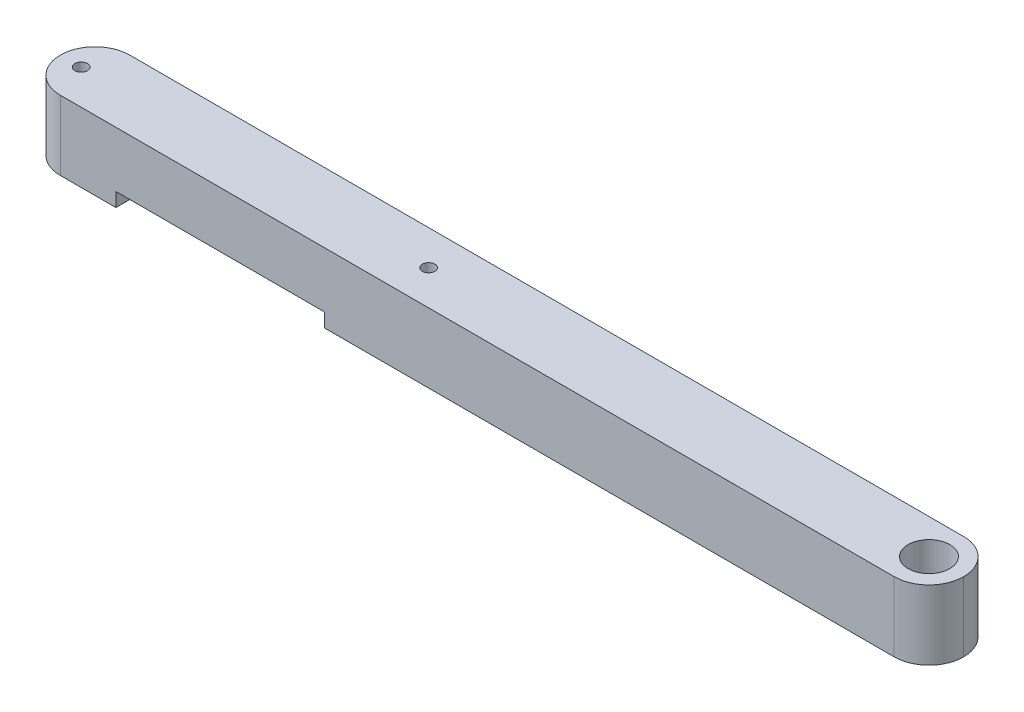
ISO-10303-21;
HEADER;
FILE_DESCRIPTION(('STEP AP214'),'2;1');
FILE_NAME('part.step','',(''),(''),'','','');
FILE_SCHEMA(('AUTOMOTIVE_DESIGN { 1 0 10303 214 1 1 1 1 }'));
ENDSEC;
DATA;
#1=APPLICATION_CONTEXT('core data for automotive mechanical design processes');
#2=APPLICATION_PROTOCOL_DEFINITION('international standard','automotive_design',2000,#1);
#3=PRODUCT_CONTEXT('',#1,'mechanical');
#4=PRODUCT('Part','Part','',(#3));
#5=PRODUCT_RELATED_PRODUCT_CATEGORY('part','',(#4));
#6=PRODUCT_DEFINITION_FORMATION('','',#4);
#7=PRODUCT_DEFINITION_CONTEXT('part definition',#1,'design');
#8=PRODUCT_DEFINITION('design','',#6,#7);
#9=PRODUCT_DEFINITION_SHAPE('','',#8);
#10=(LENGTH_UNIT() NAMED_UNIT(*) SI_UNIT(.MILLI.,.METRE.));
#11=(NAMED_UNIT(*) PLANE_ANGLE_UNIT() SI_UNIT($,.RADIAN.));
#12=(NAMED_UNIT(*) SI_UNIT($,.STERADIAN.) SOLID_ANGLE_UNIT());
#13=UNCERTAINTY_MEASURE_WITH_UNIT(LENGTH_MEASURE(1.E-05),#10,'distance_accuracy_value','');
#14=(GEOMETRIC_REPRESENTATION_CONTEXT(3) GLOBAL_UNCERTAINTY_ASSIGNED_CONTEXT((#13)) GLOBAL_UNIT_ASSIGNED_CONTEXT((#10,
#11,#12)) REPRESENTATION_CONTEXT('',''));
#15=CARTESIAN_POINT('',(0.,0.,0.));
#16=DIRECTION('',(0.,0.,1.));
#17=DIRECTION('',(1.,0.,0.));
#18=AXIS2_PLACEMENT_3D('',#15,#16,#17);
#19=CARTESIAN_POINT('',(0.,0.,0.));
#20=DIRECTION('',(0.,-1.,0.));
#21=DIRECTION('',(0.,0.,-1.));
#22=AXIS2_PLACEMENT_3D('',#19,#20,#21);
#23=PLANE('',#22);
#24=DIRECTION('',(1.,0.,0.));
#25=VECTOR('',#24,1.);
#26=CARTESIAN_POINT('',(0.,0.,0.));
#27=LINE('',#26,#25);
#28=CARTESIAN_POINT('',(5.,0.,0.));
#29=VERTEX_POINT('',#28);
#30=CARTESIAN_POINT('',(13.,0.,0.));
#31=VERTEX_POINT('',#30);
#32=EDGE_CURVE('E137',#29,#31,#27,.T.);
#33=ORIENTED_EDGE('',*,*,#32,.F.);
#34=CARTESIAN_POINT('',(5.,0.,-5.));
#35=DIRECTION('',(0.,-1.,0.));
#36=DIRECTION('',(0.,0.,-1.));
#37=AXIS2_PLACEMENT_3D('',#34,#35,#36);
#38=CIRCLE('',#37,5.);
#39=CARTESIAN_POINT('',(0.,0.,-5.));
#40=VERTEX_POINT('',#39);
#41=EDGE_CURVE('E11',#29,#40,#38,.T.);
#42=ORIENTED_EDGE('',*,*,#41,.T.);
#43=CARTESIAN_POINT('',(5.,0.,-5.));
#44=DIRECTION('',(0.,-1.,0.));
#45=DIRECTION('',(0.,0.,-1.));
#46=AXIS2_PLACEMENT_3D('',#43,#44,#45);
#47=CIRCLE('',#46,5.);
#48=CARTESIAN_POINT('',(5.,0.,-10.));
#49=VERTEX_POINT('',#48);
#50=EDGE_CURVE('E48',#40,#49,#47,.T.);
#51=ORIENTED_EDGE('',*,*,#50,.T.);
#52=DIRECTION('',(-1.,0.,0.));
#53=VECTOR('',#52,1.);
#54=CARTESIAN_POINT('',(0.,0.,-10.));
#55=LINE('',#54,#53);
#56=CARTESIAN_POINT('',(13.,0.,-10.));
#57=VERTEX_POINT('',#56);
#58=EDGE_CURVE('E129',#57,#49,#55,.T.);
#59=ORIENTED_EDGE('',*,*,#58,.F.);
#60=DIRECTION('',(0.,0.,1.));
#61=VECTOR('',#60,1.);
#62=CARTESIAN_POINT('',(13.,0.,-10.));
#63=LINE('',#62,#61);
#64=EDGE_CURVE('E115',#57,#31,#63,.T.);
#65=ORIENTED_EDGE('',*,*,#64,.T.);
#66=EDGE_LOOP('',(#33,#42,#51,#59,#65));
#67=FACE_BOUND('',#66,.T.);
#68=CARTESIAN_POINT('',(3.,0.,-5.));
#69=DIRECTION('',(0.,1.,0.));
#70=DIRECTION('',(0.,0.,1.));
#71=AXIS2_PLACEMENT_3D('',#68,#69,#70);
#72=CIRCLE('',#71,0.9);
#73=CARTESIAN_POINT('',(3.,0.,-4.1));
#74=VERTEX_POINT('',#73);
#75=EDGE_CURVE('E188',#74,#74,#72,.T.);
#76=ORIENTED_EDGE('',*,*,#75,.T.);
#77=EDGE_LOOP('',(#76));
#78=FACE_BOUND('',#77,.T.);
#79=ADVANCED_FACE('F39',(#67,#78),#23,.T.);
#80=CARTESIAN_POINT('',(0.,10.,0.));
#81=DIRECTION('',(0.,-1.,0.));
#82=DIRECTION('',(0.,0.,-1.));
#83=AXIS2_PLACEMENT_3D('',#80,#81,#82);
#84=PLANE('',#83);
#85=DIRECTION('',(1.,0.,0.));
#86=VECTOR('',#85,1.);
#87=CARTESIAN_POINT('',(0.,10.,0.));
#88=LINE('',#87,#86);
#89=CARTESIAN_POINT('',(5.,10.,0.));
#90=VERTEX_POINT('',#89);
#91=CARTESIAN_POINT('',(125.,10.,0.));
#92=VERTEX_POINT('',#91);
#93=EDGE_CURVE('E139',#90,#92,#88,.T.);
#94=ORIENTED_EDGE('',*,*,#93,.T.);
#95=CARTESIAN_POINT('',(125.,10.,-5.));
#96=DIRECTION('',(0.,-1.,0.));
#97=DIRECTION('',(0.,0.,-1.));
#98=AXIS2_PLACEMENT_3D('',#95,#96,#97);
#99=CIRCLE('',#98,5.);
#100=CARTESIAN_POINT('',(130.,10.,-5.));
#101=VERTEX_POINT('',#100);
#102=EDGE_CURVE('E161',#92,#101,#99,.F.);
#103=ORIENTED_EDGE('',*,*,#102,.T.);
#104=CARTESIAN_POINT('',(125.,10.,-5.));
#105=DIRECTION('',(0.,-1.,0.));
#106=DIRECTION('',(0.,0.,-1.));
#107=AXIS2_PLACEMENT_3D('',#104,#105,#106);
#108=CIRCLE('',#107,5.);
#109=CARTESIAN_POINT('',(125.,10.,-10.));
#110=VERTEX_POINT('',#109);
#111=EDGE_CURVE('E159',#101,#110,#108,.F.);
#112=ORIENTED_EDGE('',*,*,#111,.T.);
#113=DIRECTION('',(-1.,0.,0.));
#114=VECTOR('',#113,1.);
#115=CARTESIAN_POINT('',(0.,10.,-10.));
#116=LINE('',#115,#114);
#117=CARTESIAN_POINT('',(5.,10.,-10.));
#118=VERTEX_POINT('',#117);
#119=EDGE_CURVE('E147',#110,#118,#116,.T.);
#120=ORIENTED_EDGE('',*,*,#119,.T.);
#121=CARTESIAN_POINT('',(5.,10.,-5.));
#122=DIRECTION('',(0.,-1.,0.));
#123=DIRECTION('',(0.,0.,-1.));
#124=AXIS2_PLACEMENT_3D('',#121,#122,#123);
#125=CIRCLE('',#124,5.);
#126=CARTESIAN_POINT('',(0.,10.,-5.));
#127=VERTEX_POINT('',#126);
#128=EDGE_CURVE('E155',#118,#127,#125,.F.);
#129=ORIENTED_EDGE('',*,*,#128,.T.);
#130=CARTESIAN_POINT('',(5.,10.,-5.));
#131=DIRECTION('',(0.,-1.,0.));
#132=DIRECTION('',(0.,0.,-1.));
#133=AXIS2_PLACEMENT_3D('',#130,#131,#132);
#134=CIRCLE('',#133,5.);
#135=EDGE_CURVE('E157',#127,#90,#134,.F.);
#136=ORIENTED_EDGE('',*,*,#135,.T.);
#137=EDGE_LOOP('',(#94,#103,#112,#120,#129,#136));
#138=FACE_BOUND('',#137,.T.);
#139=CARTESIAN_POINT('',(3.,10.,-5.));
#140=DIRECTION('',(0.,1.,0.));
#141=DIRECTION('',(0.,0.,1.));
#142=AXIS2_PLACEMENT_3D('',#139,#140,#141);
#143=CIRCLE('',#142,0.9);
#144=CARTESIAN_POINT('',(3.,10.,-4.1));
#145=VERTEX_POINT('',#144);
#146=EDGE_CURVE('E191',#145,#145,#143,.T.);
#147=ORIENTED_EDGE('',*,*,#146,.F.);
#148=EDGE_LOOP('',(#147));
#149=FACE_BOUND('',#148,.T.);
#150=CARTESIAN_POINT('',(53.,10.,-5.));
#151=DIRECTION('',(0.,1.,0.));
#152=DIRECTION('',(0.,0.,1.));
#153=AXIS2_PLACEMENT_3D('',#150,#151,#152);
#154=CIRCLE('',#153,0.899999999999997);
#155=CARTESIAN_POINT('',(53.,10.,-4.1));
#156=VERTEX_POINT('',#155);
#157=EDGE_CURVE('E192',#156,#156,#154,.T.);
#158=ORIENTED_EDGE('',*,*,#157,.F.);
#159=EDGE_LOOP('',(#158));
#160=FACE_BOUND('',#159,.T.);
#161=CARTESIAN_POINT('',(125.,10.,-5.));
#162=DIRECTION('',(0.,1.,0.));
#163=DIRECTION('',(0.,0.,1.));
#164=AXIS2_PLACEMENT_3D('',#161,#162,#163);
#165=CIRCLE('',#164,2.99999999999999);
#166=CARTESIAN_POINT('',(125.,10.,-2.00000000000001));
#167=VERTEX_POINT('',#166);
#168=EDGE_CURVE('E198',#167,#167,#165,.T.);
#169=ORIENTED_EDGE('',*,*,#168,.F.);
#170=EDGE_LOOP('',(#169));
#171=FACE_BOUND('',#170,.T.);
#172=ADVANCED_FACE('F183',(#138,#149,#160,#171),#84,.F.);
#173=CARTESIAN_POINT('',(125.,0.,-5.));
#174=DIRECTION('',(0.,-1.,0.));
#175=DIRECTION('',(0.,0.,-1.));
#176=AXIS2_PLACEMENT_3D('',#173,#174,#175);
#177=CIRCLE('',#176,5.);
#178=CARTESIAN_POINT('',(125.,0.,-10.));
#179=VERTEX_POINT('',#178);
#180=CARTESIAN_POINT('',(130.,0.,-5.));
#181=VERTEX_POINT('',#180);
#182=EDGE_CURVE('E144',#179,#181,#177,.T.);
#183=ORIENTED_EDGE('',*,*,#182,.T.);
#184=CARTESIAN_POINT('',(125.,0.,-5.));
#185=DIRECTION('',(0.,-1.,0.));
#186=DIRECTION('',(0.,0.,-1.));
#187=AXIS2_PLACEMENT_3D('',#184,#185,#186);
#188=CIRCLE('',#187,5.);
#189=CARTESIAN_POINT('',(125.,0.,0.));
#190=VERTEX_POINT('',#189);
#191=EDGE_CURVE('E146',#181,#190,#188,.T.);
#192=ORIENTED_EDGE('',*,*,#191,.T.);
#193=CARTESIAN_POINT('',(43.,0.,0.));
#194=VERTEX_POINT('',#193);
#195=EDGE_CURVE('E140',#194,#190,#27,.T.);
#196=ORIENTED_EDGE('',*,*,#195,.F.);
#197=DIRECTION('',(0.,0.,1.));
#198=VECTOR('',#197,1.);
#199=CARTESIAN_POINT('',(43.,0.,-10.));
#200=LINE('',#199,#198);
#201=CARTESIAN_POINT('',(43.,0.,-10.));
#202=VERTEX_POINT('',#201);
#203=EDGE_CURVE('E123',#202,#194,#200,.T.);
#204=ORIENTED_EDGE('',*,*,#203,.F.);
#205=EDGE_CURVE('E136',#179,#202,#55,.T.);
#206=ORIENTED_EDGE('',*,*,#205,.F.);
#207=EDGE_LOOP('',(#183,#192,#196,#204,#206));
#208=FACE_BOUND('',#207,.T.);
#209=CARTESIAN_POINT('',(53.,0.,-5.));
#210=DIRECTION('',(0.,1.,0.));
#211=DIRECTION('',(0.,0.,1.));
#212=AXIS2_PLACEMENT_3D('',#209,#210,#211);
#213=CIRCLE('',#212,0.899999999999997);
#214=CARTESIAN_POINT('',(53.,0.,-4.1));
#215=VERTEX_POINT('',#214);
#216=EDGE_CURVE('E195',#215,#215,#213,.T.);
#217=ORIENTED_EDGE('',*,*,#216,.T.);
#218=EDGE_LOOP('',(#217));
#219=FACE_BOUND('',#218,.T.);
#220=CARTESIAN_POINT('',(125.,0.,-5.));
#221=DIRECTION('',(0.,1.,0.));
#222=DIRECTION('',(0.,0.,1.));
#223=AXIS2_PLACEMENT_3D('',#220,#221,#222);
#224=CIRCLE('',#223,2.99999999999999);
#225=CARTESIAN_POINT('',(125.,0.,-2.00000000000001));
#226=VERTEX_POINT('',#225);
#227=EDGE_CURVE('E201',#226,#226,#224,.T.);
#228=ORIENTED_EDGE('',*,*,#227,.T.);
#229=EDGE_LOOP('',(#228));
#230=FACE_BOUND('',#229,.T.);
#231=ADVANCED_FACE('F228',(#208,#219,#230),#23,.T.);
#232=CARTESIAN_POINT('',(0.,10.,0.));
#233=DIRECTION('',(0.,0.,-1.));
#234=DIRECTION('',(-1.,0.,0.));
#235=AXIS2_PLACEMENT_3D('',#232,#233,#234);
#236=PLANE('',#235);
#237=ORIENTED_EDGE('',*,*,#195,.T.);
#238=DIRECTION('',(0.,-1.,0.));
#239=VECTOR('',#238,1.);
#240=CARTESIAN_POINT('',(125.,10.,0.));
#241=LINE('',#240,#239);
#242=EDGE_CURVE('E152',#190,#92,#241,.F.);
#243=ORIENTED_EDGE('',*,*,#242,.T.);
#244=ORIENTED_EDGE('',*,*,#93,.F.);
#245=DIRECTION('',(0.,-1.,0.));
#246=VECTOR('',#245,1.);
#247=CARTESIAN_POINT('',(5.,10.,0.));
#248=LINE('',#247,#246);
#249=EDGE_CURVE('E149',#90,#29,#248,.T.);
#250=ORIENTED_EDGE('',*,*,#249,.T.);
#251=ORIENTED_EDGE('',*,*,#32,.T.);
#252=DIRECTION('',(0.,1.,0.));
#253=VECTOR('',#252,1.);
#254=CARTESIAN_POINT('',(13.,10.,0.));
#255=LINE('',#254,#253);
#256=CARTESIAN_POINT('',(13.,2.,0.));
#257=VERTEX_POINT('',#256);
#258=EDGE_CURVE('E122',#31,#257,#255,.T.);
#259=ORIENTED_EDGE('',*,*,#258,.T.);
#260=DIRECTION('',(1.,0.,0.));
#261=VECTOR('',#260,1.);
#262=CARTESIAN_POINT('',(0.,2.,0.));
#263=LINE('',#262,#261);
#264=CARTESIAN_POINT('',(43.,2.,0.));
#265=VERTEX_POINT('',#264);
#266=EDGE_CURVE('E207',#257,#265,#263,.T.);
#267=ORIENTED_EDGE('',*,*,#266,.T.);
#268=DIRECTION('',(0.,-1.,0.));
#269=VECTOR('',#268,1.);
#270=CARTESIAN_POINT('',(43.,10.,0.));
#271=LINE('',#270,#269);
#272=EDGE_CURVE('E210',#265,#194,#271,.T.);
#273=ORIENTED_EDGE('',*,*,#272,.T.);
#274=EDGE_LOOP('',(#237,#243,#244,#250,#251,#259,#267,#273));
#275=FACE_BOUND('',#274,.T.);
#276=ADVANCED_FACE('F234',(#275),#236,.F.);
#277=CARTESIAN_POINT('',(0.,10.,-10.));
#278=DIRECTION('',(0.,0.,1.));
#279=DIRECTION('',(1.,0.,0.));
#280=AXIS2_PLACEMENT_3D('',#277,#278,#279);
#281=PLANE('',#280);
#282=ORIENTED_EDGE('',*,*,#119,.F.);
#283=DIRECTION('',(0.,-1.,0.));
#284=VECTOR('',#283,1.);
#285=CARTESIAN_POINT('',(125.,10.,-10.));
#286=LINE('',#285,#284);
#287=EDGE_CURVE('E165',#110,#179,#286,.T.);
#288=ORIENTED_EDGE('',*,*,#287,.T.);
#289=ORIENTED_EDGE('',*,*,#205,.T.);
#290=DIRECTION('',(0.,1.,0.));
#291=VECTOR('',#290,1.);
#292=CARTESIAN_POINT('',(43.,0.,-10.));
#293=LINE('',#292,#291);
#294=CARTESIAN_POINT('',(43.,2.,-10.));
#295=VERTEX_POINT('',#294);
#296=EDGE_CURVE('E132',#202,#295,#293,.T.);
#297=ORIENTED_EDGE('',*,*,#296,.T.);
#298=DIRECTION('',(-1.,0.,0.));
#299=VECTOR('',#298,1.);
#300=CARTESIAN_POINT('',(13.,2.,-10.));
#301=LINE('',#300,#299);
#302=CARTESIAN_POINT('',(13.,2.,-10.));
#303=VERTEX_POINT('',#302);
#304=EDGE_CURVE('E124',#295,#303,#301,.T.);
#305=ORIENTED_EDGE('',*,*,#304,.T.);
#306=DIRECTION('',(0.,-1.,0.));
#307=VECTOR('',#306,1.);
#308=CARTESIAN_POINT('',(13.,0.,-10.));
#309=LINE('',#308,#307);
#310=EDGE_CURVE('E119',#303,#57,#309,.T.);
#311=ORIENTED_EDGE('',*,*,#310,.T.);
#312=ORIENTED_EDGE('',*,*,#58,.T.);
#313=DIRECTION('',(0.,-1.,0.));
#314=VECTOR('',#313,1.);
#315=CARTESIAN_POINT('',(5.,10.,-10.));
#316=LINE('',#315,#314);
#317=EDGE_CURVE('E163',#49,#118,#316,.F.);
#318=ORIENTED_EDGE('',*,*,#317,.T.);
#319=EDGE_LOOP('',(#282,#288,#289,#297,#305,#311,#312,#318));
#320=FACE_BOUND('',#319,.T.);
#321=ADVANCED_FACE('F128',(#320),#281,.F.);
#322=CARTESIAN_POINT('',(3.,10.,-5.));
#323=DIRECTION('',(0.,-1.,0.));
#324=DIRECTION('',(0.,0.,-1.));
#325=AXIS2_PLACEMENT_3D('',#322,#323,#324);
#326=CYLINDRICAL_SURFACE('',#325,0.9);
#327=ORIENTED_EDGE('',*,*,#146,.T.);
#328=EDGE_LOOP('',(#327));
#329=FACE_BOUND('',#328,.T.);
#330=ORIENTED_EDGE('',*,*,#75,.F.);
#331=EDGE_LOOP('',(#330));
#332=FACE_BOUND('',#331,.T.);
#333=ADVANCED_FACE('F263',(#329,#332),#326,.F.);
#334=CARTESIAN_POINT('',(53.,10.,-5.));
#335=DIRECTION('',(0.,-1.,0.));
#336=DIRECTION('',(0.,0.,-1.));
#337=AXIS2_PLACEMENT_3D('',#334,#335,#336);
#338=CYLINDRICAL_SURFACE('',#337,0.899999999999997);
#339=ORIENTED_EDGE('',*,*,#157,.T.);
#340=EDGE_LOOP('',(#339));
#341=FACE_BOUND('',#340,.T.);
#342=ORIENTED_EDGE('',*,*,#216,.F.);
#343=EDGE_LOOP('',(#342));
#344=FACE_BOUND('',#343,.T.);
#345=ADVANCED_FACE('F267',(#341,#344),#338,.F.);
#346=CARTESIAN_POINT('',(125.,10.,-5.));
#347=DIRECTION('',(0.,-1.,0.));
#348=DIRECTION('',(0.,0.,-1.));
#349=AXIS2_PLACEMENT_3D('',#346,#347,#348);
#350=CYLINDRICAL_SURFACE('',#349,2.99999999999999);
#351=ORIENTED_EDGE('',*,*,#168,.T.);
#352=EDGE_LOOP('',(#351));
#353=FACE_BOUND('',#352,.T.);
#354=ORIENTED_EDGE('',*,*,#227,.F.);
#355=EDGE_LOOP('',(#354));
#356=FACE_BOUND('',#355,.T.);
#357=ADVANCED_FACE('F273',(#353,#356),#350,.F.);
#358=CARTESIAN_POINT('',(13.,0.,-10.));
#359=DIRECTION('',(-1.,0.,0.));
#360=DIRECTION('',(0.,0.,1.));
#361=AXIS2_PLACEMENT_3D('',#358,#359,#360);
#362=PLANE('',#361);
#363=ORIENTED_EDGE('',*,*,#64,.F.);
#364=ORIENTED_EDGE('',*,*,#310,.F.);
#365=DIRECTION('',(0.,0.,1.));
#366=VECTOR('',#365,1.);
#367=CARTESIAN_POINT('',(13.,2.,-10.));
#368=LINE('',#367,#366);
#369=EDGE_CURVE('E212',#303,#257,#368,.T.);
#370=ORIENTED_EDGE('',*,*,#369,.T.);
#371=ORIENTED_EDGE('',*,*,#258,.F.);
#372=EDGE_LOOP('',(#363,#364,#370,#371));
#373=FACE_BOUND('',#372,.T.);
#374=ADVANCED_FACE('F117',(#373),#362,.F.);
#375=CARTESIAN_POINT('',(13.,2.,-10.));
#376=DIRECTION('',(0.,1.,0.));
#377=DIRECTION('',(0.,0.,1.));
#378=AXIS2_PLACEMENT_3D('',#375,#376,#377);
#379=PLANE('',#378);
#380=ORIENTED_EDGE('',*,*,#369,.F.);
#381=ORIENTED_EDGE('',*,*,#304,.F.);
#382=DIRECTION('',(0.,0.,1.));
#383=VECTOR('',#382,1.);
#384=CARTESIAN_POINT('',(43.,2.,-10.));
#385=LINE('',#384,#383);
#386=EDGE_CURVE('E215',#295,#265,#385,.T.);
#387=ORIENTED_EDGE('',*,*,#386,.T.);
#388=ORIENTED_EDGE('',*,*,#266,.F.);
#389=EDGE_LOOP('',(#380,#381,#387,#388));
#390=FACE_BOUND('',#389,.T.);
#391=ADVANCED_FACE('F247',(#390),#379,.F.);
#392=CARTESIAN_POINT('',(43.,0.,-10.));
#393=DIRECTION('',(1.,0.,0.));
#394=DIRECTION('',(0.,0.,-1.));
#395=AXIS2_PLACEMENT_3D('',#392,#393,#394);
#396=PLANE('',#395);
#397=ORIENTED_EDGE('',*,*,#386,.F.);
#398=ORIENTED_EDGE('',*,*,#296,.F.);
#399=ORIENTED_EDGE('',*,*,#203,.T.);
#400=ORIENTED_EDGE('',*,*,#272,.F.);
#401=EDGE_LOOP('',(#397,#398,#399,#400));
#402=FACE_BOUND('',#401,.T.);
#403=ADVANCED_FACE('F225',(#402),#396,.F.);
#404=CARTESIAN_POINT('',(125.,10.,-5.));
#405=DIRECTION('',(0.,-1.,0.));
#406=DIRECTION('',(0.,0.,-1.));
#407=AXIS2_PLACEMENT_3D('',#404,#405,#406);
#408=CYLINDRICAL_SURFACE('',#407,5.);
#409=ORIENTED_EDGE('',*,*,#287,.F.);
#410=ORIENTED_EDGE('',*,*,#111,.F.);
#411=DIRECTION('',(0.,-1.,0.));
#412=VECTOR('',#411,1.);
#413=CARTESIAN_POINT('',(130.,10.,-5.));
#414=LINE('',#413,#412);
#415=EDGE_CURVE('E133',#181,#101,#414,.F.);
#416=ORIENTED_EDGE('',*,*,#415,.F.);
#417=ORIENTED_EDGE('',*,*,#182,.F.);
#418=EDGE_LOOP('',(#409,#410,#416,#417));
#419=FACE_BOUND('',#418,.T.);
#420=ADVANCED_FACE('F238',(#419),#408,.T.);
#421=CARTESIAN_POINT('',(125.,10.,-5.));
#422=DIRECTION('',(0.,-1.,0.));
#423=DIRECTION('',(0.,0.,-1.));
#424=AXIS2_PLACEMENT_3D('',#421,#422,#423);
#425=CYLINDRICAL_SURFACE('',#424,5.);
#426=ORIENTED_EDGE('',*,*,#102,.F.);
#427=ORIENTED_EDGE('',*,*,#242,.F.);
#428=ORIENTED_EDGE('',*,*,#191,.F.);
#429=ORIENTED_EDGE('',*,*,#415,.T.);
#430=EDGE_LOOP('',(#426,#427,#428,#429));
#431=FACE_BOUND('',#430,.T.);
#432=ADVANCED_FACE('F236',(#431),#425,.T.);
#433=CARTESIAN_POINT('',(5.,10.,-5.));
#434=DIRECTION('',(0.,-1.,0.));
#435=DIRECTION('',(0.,0.,-1.));
#436=AXIS2_PLACEMENT_3D('',#433,#434,#435);
#437=CYLINDRICAL_SURFACE('',#436,5.);
#438=DIRECTION('',(0.,-1.,0.));
#439=VECTOR('',#438,1.);
#440=CARTESIAN_POINT('',(0.,10.,-5.));
#441=LINE('',#440,#439);
#442=EDGE_CURVE('E43',#127,#40,#441,.T.);
#443=ORIENTED_EDGE('',*,*,#442,.F.);
#444=ORIENTED_EDGE('',*,*,#128,.F.);
#445=ORIENTED_EDGE('',*,*,#317,.F.);
#446=ORIENTED_EDGE('',*,*,#50,.F.);
#447=EDGE_LOOP('',(#443,#444,#445,#446));
#448=FACE_BOUND('',#447,.T.);
#449=ADVANCED_FACE('F41',(#448),#437,.T.);
#450=CARTESIAN_POINT('',(5.,10.,-5.));
#451=DIRECTION('',(0.,-1.,0.));
#452=DIRECTION('',(0.,0.,-1.));
#453=AXIS2_PLACEMENT_3D('',#450,#451,#452);
#454=CYLINDRICAL_SURFACE('',#453,5.);
#455=ORIENTED_EDGE('',*,*,#135,.F.);
#456=ORIENTED_EDGE('',*,*,#442,.T.);
#457=ORIENTED_EDGE('',*,*,#41,.F.);
#458=ORIENTED_EDGE('',*,*,#249,.F.);
#459=EDGE_LOOP('',(#455,#456,#457,#458));
#460=FACE_BOUND('',#459,.T.);
#461=ADVANCED_FACE('F175',(#460),#454,.T.);
#462=CLOSED_SHELL('',(#79,#172,#231,#276,#321,#333,#345,#357,#374,#391,#403,#420,#432,#449,#461));
#463=MANIFOLD_SOLID_BREP('B2',#462);
#464=ADVANCED_BREP_SHAPE_REPRESENTATION('',(#18,#463),#14);
#465=SHAPE_DEFINITION_REPRESENTATION(#9,#464);
ENDSEC;
END-ISO-10303-21;
